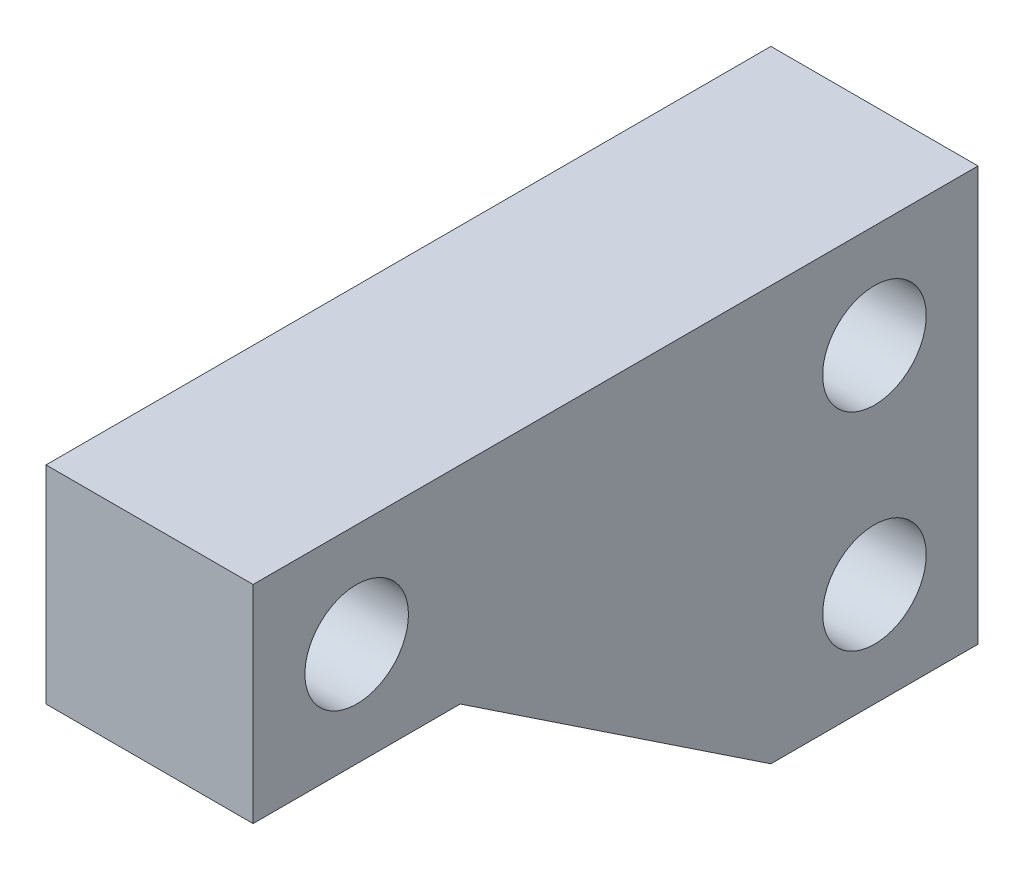
ISO-10303-21;
HEADER;
FILE_DESCRIPTION(('STEP AP214'),'2;1');
FILE_NAME('part.step','',(''),(''),'','','');
FILE_SCHEMA(('AUTOMOTIVE_DESIGN { 1 0 10303 214 1 1 1 1 }'));
ENDSEC;
DATA;
#1=APPLICATION_CONTEXT('core data for automotive mechanical design processes');
#2=APPLICATION_PROTOCOL_DEFINITION('international standard','automotive_design',2000,#1);
#3=PRODUCT_CONTEXT('',#1,'mechanical');
#4=PRODUCT('Part','Part','',(#3));
#5=PRODUCT_RELATED_PRODUCT_CATEGORY('part','',(#4));
#6=PRODUCT_DEFINITION_FORMATION('','',#4);
#7=PRODUCT_DEFINITION_CONTEXT('part definition',#1,'design');
#8=PRODUCT_DEFINITION('design','',#6,#7);
#9=PRODUCT_DEFINITION_SHAPE('','',#8);
#10=(LENGTH_UNIT() NAMED_UNIT(*) SI_UNIT(.MILLI.,.METRE.));
#11=(NAMED_UNIT(*) PLANE_ANGLE_UNIT() SI_UNIT($,.RADIAN.));
#12=(NAMED_UNIT(*) SI_UNIT($,.STERADIAN.) SOLID_ANGLE_UNIT());
#13=UNCERTAINTY_MEASURE_WITH_UNIT(LENGTH_MEASURE(1.E-05),#10,'distance_accuracy_value','');
#14=(GEOMETRIC_REPRESENTATION_CONTEXT(3) GLOBAL_UNCERTAINTY_ASSIGNED_CONTEXT((#13)) GLOBAL_UNIT_ASSIGNED_CONTEXT((#10,
#11,#12)) REPRESENTATION_CONTEXT('',''));
#15=CARTESIAN_POINT('',(0.,0.,0.));
#16=DIRECTION('',(0.,0.,1.));
#17=DIRECTION('',(1.,0.,0.));
#18=AXIS2_PLACEMENT_3D('',#15,#16,#17);
#19=CARTESIAN_POINT('',(10.,3.5143436004239,0.));
#20=DIRECTION('',(0.,1.,0.));
#21=DIRECTION('',(0.,0.,1.));
#22=AXIS2_PLACEMENT_3D('',#19,#20,#21);
#23=PLANE('',#22);
#24=DIRECTION('',(0.,0.,-1.));
#25=VECTOR('',#24,1.);
#26=CARTESIAN_POINT('',(0.,3.5143436004239,0.));
#27=LINE('',#26,#25);
#28=CARTESIAN_POINT('',(0.,3.5143436004239,47.2463711361738));
#29=VERTEX_POINT('',#28);
#30=CARTESIAN_POINT('',(0.,3.5143436004239,12.2463711361738));
#31=VERTEX_POINT('',#30);
#32=EDGE_CURVE('E127',#29,#31,#27,.T.);
#33=ORIENTED_EDGE('',*,*,#32,.F.);
#34=DIRECTION('',(-1.,0.,0.));
#35=VECTOR('',#34,1.);
#36=CARTESIAN_POINT('',(10.,3.5143436004239,47.2463711361738));
#37=LINE('',#36,#35);
#38=CARTESIAN_POINT('',(10.,3.5143436004239,47.2463711361738));
#39=VERTEX_POINT('',#38);
#40=EDGE_CURVE('E11',#39,#29,#37,.T.);
#41=ORIENTED_EDGE('',*,*,#40,.F.);
#42=DIRECTION('',(0.,0.,-1.));
#43=VECTOR('',#42,1.);
#44=CARTESIAN_POINT('',(10.,3.5143436004239,0.));
#45=LINE('',#44,#43);
#46=CARTESIAN_POINT('',(10.,3.5143436004239,12.2463711361738));
#47=VERTEX_POINT('',#46);
#48=EDGE_CURVE('E148',#39,#47,#45,.T.);
#49=ORIENTED_EDGE('',*,*,#48,.T.);
#50=DIRECTION('',(-1.,0.,0.));
#51=VECTOR('',#50,1.);
#52=CARTESIAN_POINT('',(10.,3.5143436004239,12.2463711361738));
#53=LINE('',#52,#51);
#54=EDGE_CURVE('E51',#47,#31,#53,.T.);
#55=ORIENTED_EDGE('',*,*,#54,.T.);
#56=EDGE_LOOP('',(#33,#41,#49,#55));
#57=FACE_BOUND('',#56,.T.);
#58=ADVANCED_FACE('F35',(#57),#23,.T.);
#59=CARTESIAN_POINT('',(10.,0.,47.2463711361738));
#60=DIRECTION('',(0.,0.,-1.));
#61=DIRECTION('',(-1.,0.,0.));
#62=AXIS2_PLACEMENT_3D('',#59,#60,#61);
#63=PLANE('',#62);
#64=DIRECTION('',(0.,-1.,0.));
#65=VECTOR('',#64,1.);
#66=CARTESIAN_POINT('',(0.,0.,47.2463711361738));
#67=LINE('',#66,#65);
#68=CARTESIAN_POINT('',(0.,-6.4856563995761,47.2463711361738));
#69=VERTEX_POINT('',#68);
#70=EDGE_CURVE('E129',#29,#69,#67,.T.);
#71=ORIENTED_EDGE('',*,*,#70,.T.);
#72=DIRECTION('',(-1.,0.,0.));
#73=VECTOR('',#72,1.);
#74=CARTESIAN_POINT('',(10.,-6.4856563995761,47.2463711361738));
#75=LINE('',#74,#73);
#76=CARTESIAN_POINT('',(10.,-6.4856563995761,47.2463711361738));
#77=VERTEX_POINT('',#76);
#78=EDGE_CURVE('E43',#77,#69,#75,.T.);
#79=ORIENTED_EDGE('',*,*,#78,.F.);
#80=DIRECTION('',(0.,-1.,0.));
#81=VECTOR('',#80,1.);
#82=CARTESIAN_POINT('',(10.,0.,47.2463711361738));
#83=LINE('',#82,#81);
#84=EDGE_CURVE('E292',#39,#77,#83,.T.);
#85=ORIENTED_EDGE('',*,*,#84,.F.);
#86=ORIENTED_EDGE('',*,*,#40,.T.);
#87=EDGE_LOOP('',(#71,#79,#85,#86));
#88=FACE_BOUND('',#87,.T.);
#89=ADVANCED_FACE('F177',(#88),#63,.F.);
#90=CARTESIAN_POINT('',(10.,-6.4856563995761,0.));
#91=DIRECTION('',(0.,1.,0.));
#92=DIRECTION('',(0.,0.,1.));
#93=AXIS2_PLACEMENT_3D('',#90,#91,#92);
#94=PLANE('',#93);
#95=DIRECTION('',(0.,0.,-1.));
#96=VECTOR('',#95,1.);
#97=CARTESIAN_POINT('',(0.,-6.4856563995761,0.));
#98=LINE('',#97,#96);
#99=CARTESIAN_POINT('',(0.,-6.4856563995761,37.2463711361738));
#100=VERTEX_POINT('',#99);
#101=EDGE_CURVE('E131',#69,#100,#98,.T.);
#102=ORIENTED_EDGE('',*,*,#101,.T.);
#103=DIRECTION('',(-1.,0.,0.));
#104=VECTOR('',#103,1.);
#105=CARTESIAN_POINT('',(10.,-6.4856563995761,37.2463711361738));
#106=LINE('',#105,#104);
#107=CARTESIAN_POINT('',(10.,-6.4856563995761,37.2463711361738));
#108=VERTEX_POINT('',#107);
#109=EDGE_CURVE('E110',#108,#100,#106,.T.);
#110=ORIENTED_EDGE('',*,*,#109,.F.);
#111=DIRECTION('',(0.,0.,-1.));
#112=VECTOR('',#111,1.);
#113=CARTESIAN_POINT('',(10.,-6.4856563995761,0.));
#114=LINE('',#113,#112);
#115=EDGE_CURVE('E98',#77,#108,#114,.T.);
#116=ORIENTED_EDGE('',*,*,#115,.F.);
#117=ORIENTED_EDGE('',*,*,#78,.T.);
#118=EDGE_LOOP('',(#102,#110,#116,#117));
#119=FACE_BOUND('',#118,.T.);
#120=ADVANCED_FACE('F155',(#119),#94,.F.);
#121=CARTESIAN_POINT('',(10.,-21.6807026471714,14.4538017647809));
#122=DIRECTION('',(0.,0.832050294337844,-0.554700196225229));
#123=DIRECTION('',(0.,0.554700196225229,0.832050294337844));
#124=AXIS2_PLACEMENT_3D('',#121,#122,#123);
#125=PLANE('',#124);
#126=DIRECTION('',(0.,-0.554700196225229,-0.832050294337844));
#127=VECTOR('',#126,1.);
#128=CARTESIAN_POINT('',(0.,-21.6807026471714,14.4538017647809));
#129=LINE('',#128,#127);
#130=CARTESIAN_POINT('',(0.,-16.4856563995761,22.2463711361738));
#131=VERTEX_POINT('',#130);
#132=EDGE_CURVE('E107',#100,#131,#129,.T.);
#133=ORIENTED_EDGE('',*,*,#132,.T.);
#134=DIRECTION('',(-1.,0.,0.));
#135=VECTOR('',#134,1.);
#136=CARTESIAN_POINT('',(10.,-16.4856563995761,22.2463711361738));
#137=LINE('',#136,#135);
#138=CARTESIAN_POINT('',(10.,-16.4856563995761,22.2463711361738));
#139=VERTEX_POINT('',#138);
#140=EDGE_CURVE('E104',#139,#131,#137,.T.);
#141=ORIENTED_EDGE('',*,*,#140,.F.);
#142=DIRECTION('',(0.,-0.554700196225229,-0.832050294337844));
#143=VECTOR('',#142,1.);
#144=CARTESIAN_POINT('',(10.,-21.6807026471714,14.4538017647809));
#145=LINE('',#144,#143);
#146=EDGE_CURVE('E89',#108,#139,#145,.T.);
#147=ORIENTED_EDGE('',*,*,#146,.F.);
#148=ORIENTED_EDGE('',*,*,#109,.T.);
#149=EDGE_LOOP('',(#133,#141,#147,#148));
#150=FACE_BOUND('',#149,.T.);
#151=ADVANCED_FACE('F105',(#150),#125,.F.);
#152=CARTESIAN_POINT('',(10.,-16.4856563995761,0.));
#153=DIRECTION('',(0.,1.,0.));
#154=DIRECTION('',(0.,0.,1.));
#155=AXIS2_PLACEMENT_3D('',#152,#153,#154);
#156=PLANE('',#155);
#157=DIRECTION('',(0.,0.,-1.));
#158=VECTOR('',#157,1.);
#159=CARTESIAN_POINT('',(0.,-16.4856563995761,0.));
#160=LINE('',#159,#158);
#161=CARTESIAN_POINT('',(0.,-16.4856563995761,12.2463711361738));
#162=VERTEX_POINT('',#161);
#163=EDGE_CURVE('E134',#131,#162,#160,.T.);
#164=ORIENTED_EDGE('',*,*,#163,.T.);
#165=DIRECTION('',(-1.,0.,0.));
#166=VECTOR('',#165,1.);
#167=CARTESIAN_POINT('',(10.,-16.4856563995761,12.2463711361738));
#168=LINE('',#167,#166);
#169=CARTESIAN_POINT('',(10.,-16.4856563995761,12.2463711361738));
#170=VERTEX_POINT('',#169);
#171=EDGE_CURVE('E71',#170,#162,#168,.T.);
#172=ORIENTED_EDGE('',*,*,#171,.F.);
#173=DIRECTION('',(0.,0.,-1.));
#174=VECTOR('',#173,1.);
#175=CARTESIAN_POINT('',(10.,-16.4856563995761,0.));
#176=LINE('',#175,#174);
#177=EDGE_CURVE('E96',#139,#170,#176,.T.);
#178=ORIENTED_EDGE('',*,*,#177,.F.);
#179=ORIENTED_EDGE('',*,*,#140,.T.);
#180=EDGE_LOOP('',(#164,#172,#178,#179));
#181=FACE_BOUND('',#180,.T.);
#182=ADVANCED_FACE('F112',(#181),#156,.F.);
#183=CARTESIAN_POINT('',(10.,-1.4856563995761,17.2463711361738));
#184=DIRECTION('',(-1.,0.,0.));
#185=DIRECTION('',(0.,0.,1.));
#186=AXIS2_PLACEMENT_3D('',#183,#184,#185);
#187=CYLINDRICAL_SURFACE('',#186,2.5);
#188=CARTESIAN_POINT('',(10.,-1.4856563995761,17.2463711361738));
#189=DIRECTION('',(1.,0.,0.));
#190=DIRECTION('',(0.,0.,-1.));
#191=AXIS2_PLACEMENT_3D('',#188,#189,#190);
#192=CIRCLE('',#191,2.5);
#193=CARTESIAN_POINT('',(10.,-1.4856563995761,14.7463711361738));
#194=VERTEX_POINT('',#193);
#195=EDGE_CURVE('E121',#194,#194,#192,.T.);
#196=ORIENTED_EDGE('',*,*,#195,.T.);
#197=EDGE_LOOP('',(#196));
#198=FACE_BOUND('',#197,.T.);
#199=CARTESIAN_POINT('',(0.,-1.4856563995761,17.2463711361738));
#200=DIRECTION('',(1.,0.,0.));
#201=DIRECTION('',(0.,0.,-1.));
#202=AXIS2_PLACEMENT_3D('',#199,#200,#201);
#203=CIRCLE('',#202,2.5);
#204=CARTESIAN_POINT('',(0.,-1.4856563995761,14.7463711361738));
#205=VERTEX_POINT('',#204);
#206=EDGE_CURVE('E142',#205,#205,#203,.T.);
#207=ORIENTED_EDGE('',*,*,#206,.F.);
#208=EDGE_LOOP('',(#207));
#209=FACE_BOUND('',#208,.T.);
#210=ADVANCED_FACE('F172',(#198,#209),#187,.F.);
#211=CARTESIAN_POINT('',(10.,-11.4856563995761,17.2463711361738));
#212=DIRECTION('',(-1.,0.,0.));
#213=DIRECTION('',(0.,0.,1.));
#214=AXIS2_PLACEMENT_3D('',#211,#212,#213);
#215=CYLINDRICAL_SURFACE('',#214,2.5);
#216=CARTESIAN_POINT('',(10.,-11.4856563995761,17.2463711361738));
#217=DIRECTION('',(1.,0.,0.));
#218=DIRECTION('',(0.,0.,-1.));
#219=AXIS2_PLACEMENT_3D('',#216,#217,#218);
#220=CIRCLE('',#219,2.5);
#221=CARTESIAN_POINT('',(10.,-11.4856563995761,14.7463711361738));
#222=VERTEX_POINT('',#221);
#223=EDGE_CURVE('E115',#222,#222,#220,.T.);
#224=ORIENTED_EDGE('',*,*,#223,.T.);
#225=EDGE_LOOP('',(#224));
#226=FACE_BOUND('',#225,.T.);
#227=CARTESIAN_POINT('',(0.,-11.4856563995761,17.2463711361738));
#228=DIRECTION('',(1.,0.,0.));
#229=DIRECTION('',(0.,0.,-1.));
#230=AXIS2_PLACEMENT_3D('',#227,#228,#229);
#231=CIRCLE('',#230,2.5);
#232=CARTESIAN_POINT('',(0.,-11.4856563995761,14.7463711361738));
#233=VERTEX_POINT('',#232);
#234=EDGE_CURVE('E139',#233,#233,#231,.T.);
#235=ORIENTED_EDGE('',*,*,#234,.F.);
#236=EDGE_LOOP('',(#235));
#237=FACE_BOUND('',#236,.T.);
#238=ADVANCED_FACE('F164',(#226,#237),#215,.F.);
#239=CARTESIAN_POINT('',(10.,0.,12.2463711361738));
#240=DIRECTION('',(0.,0.,-1.));
#241=DIRECTION('',(0.,1.,0.));
#242=AXIS2_PLACEMENT_3D('',#239,#240,#241);
#243=PLANE('',#242);
#244=DIRECTION('',(0.,-1.,0.));
#245=VECTOR('',#244,1.);
#246=CARTESIAN_POINT('',(0.,0.,12.2463711361738));
#247=LINE('',#246,#245);
#248=EDGE_CURVE('E136',#31,#162,#247,.T.);
#249=ORIENTED_EDGE('',*,*,#248,.F.);
#250=ORIENTED_EDGE('',*,*,#54,.F.);
#251=DIRECTION('',(0.,-1.,0.));
#252=VECTOR('',#251,1.);
#253=CARTESIAN_POINT('',(10.,0.,12.2463711361738));
#254=LINE('',#253,#252);
#255=EDGE_CURVE('E113',#47,#170,#254,.T.);
#256=ORIENTED_EDGE('',*,*,#255,.T.);
#257=ORIENTED_EDGE('',*,*,#171,.T.);
#258=EDGE_LOOP('',(#249,#250,#256,#257));
#259=FACE_BOUND('',#258,.T.);
#260=ADVANCED_FACE('F161',(#259),#243,.T.);
#261=CARTESIAN_POINT('',(10.,-1.4856563995761,42.2463711361738));
#262=DIRECTION('',(-1.,0.,0.));
#263=DIRECTION('',(0.,0.,1.));
#264=AXIS2_PLACEMENT_3D('',#261,#262,#263);
#265=CYLINDRICAL_SURFACE('',#264,2.5);
#266=CARTESIAN_POINT('',(10.,-1.4856563995761,42.2463711361738));
#267=DIRECTION('',(1.,0.,0.));
#268=DIRECTION('',(0.,0.,-1.));
#269=AXIS2_PLACEMENT_3D('',#266,#267,#268);
#270=CIRCLE('',#269,2.5);
#271=CARTESIAN_POINT('',(10.,-1.4856563995761,39.7463711361738));
#272=VERTEX_POINT('',#271);
#273=EDGE_CURVE('E124',#272,#272,#270,.T.);
#274=ORIENTED_EDGE('',*,*,#273,.T.);
#275=EDGE_LOOP('',(#274));
#276=FACE_BOUND('',#275,.T.);
#277=CARTESIAN_POINT('',(0.,-1.4856563995761,42.2463711361738));
#278=DIRECTION('',(1.,0.,0.));
#279=DIRECTION('',(0.,0.,-1.));
#280=AXIS2_PLACEMENT_3D('',#277,#278,#279);
#281=CIRCLE('',#280,2.5);
#282=CARTESIAN_POINT('',(0.,-1.4856563995761,39.7463711361738));
#283=VERTEX_POINT('',#282);
#284=EDGE_CURVE('E145',#283,#283,#281,.T.);
#285=ORIENTED_EDGE('',*,*,#284,.F.);
#286=EDGE_LOOP('',(#285));
#287=FACE_BOUND('',#286,.T.);
#288=ADVANCED_FACE('F163',(#276,#287),#265,.F.);
#289=CARTESIAN_POINT('',(10.,0.,0.));
#290=DIRECTION('',(1.,0.,0.));
#291=DIRECTION('',(0.,0.,-1.));
#292=AXIS2_PLACEMENT_3D('',#289,#290,#291);
#293=PLANE('',#292);
#294=ORIENTED_EDGE('',*,*,#48,.F.);
#295=ORIENTED_EDGE('',*,*,#84,.T.);
#296=ORIENTED_EDGE('',*,*,#115,.T.);
#297=ORIENTED_EDGE('',*,*,#146,.T.);
#298=ORIENTED_EDGE('',*,*,#177,.T.);
#299=ORIENTED_EDGE('',*,*,#255,.F.);
#300=EDGE_LOOP('',(#294,#295,#296,#297,#298,#299));
#301=FACE_BOUND('',#300,.T.);
#302=ORIENTED_EDGE('',*,*,#223,.F.);
#303=EDGE_LOOP('',(#302));
#304=FACE_BOUND('',#303,.T.);
#305=ORIENTED_EDGE('',*,*,#195,.F.);
#306=EDGE_LOOP('',(#305));
#307=FACE_BOUND('',#306,.T.);
#308=ORIENTED_EDGE('',*,*,#273,.F.);
#309=EDGE_LOOP('',(#308));
#310=FACE_BOUND('',#309,.T.);
#311=ADVANCED_FACE('F92',(#301,#304,#307,#310),#293,.T.);
#312=CARTESIAN_POINT('',(0.,0.,0.));
#313=DIRECTION('',(1.,0.,0.));
#314=DIRECTION('',(0.,0.,-1.));
#315=AXIS2_PLACEMENT_3D('',#312,#313,#314);
#316=PLANE('',#315);
#317=ORIENTED_EDGE('',*,*,#32,.T.);
#318=ORIENTED_EDGE('',*,*,#248,.T.);
#319=ORIENTED_EDGE('',*,*,#163,.F.);
#320=ORIENTED_EDGE('',*,*,#132,.F.);
#321=ORIENTED_EDGE('',*,*,#101,.F.);
#322=ORIENTED_EDGE('',*,*,#70,.F.);
#323=EDGE_LOOP('',(#317,#318,#319,#320,#321,#322));
#324=FACE_BOUND('',#323,.T.);
#325=ORIENTED_EDGE('',*,*,#234,.T.);
#326=EDGE_LOOP('',(#325));
#327=FACE_BOUND('',#326,.T.);
#328=ORIENTED_EDGE('',*,*,#206,.T.);
#329=EDGE_LOOP('',(#328));
#330=FACE_BOUND('',#329,.T.);
#331=ORIENTED_EDGE('',*,*,#284,.T.);
#332=EDGE_LOOP('',(#331));
#333=FACE_BOUND('',#332,.T.);
#334=ADVANCED_FACE('F159',(#324,#327,#330,#333),#316,.F.);
#335=CLOSED_SHELL('',(#58,#89,#120,#151,#182,#210,#238,#260,#288,#311,#334));
#336=MANIFOLD_SOLID_BREP('B2',#335);
#337=ADVANCED_BREP_SHAPE_REPRESENTATION('',(#18,#336),#14);
#338=SHAPE_DEFINITION_REPRESENTATION(#9,#337);
ENDSEC;
END-ISO-10303-21;
